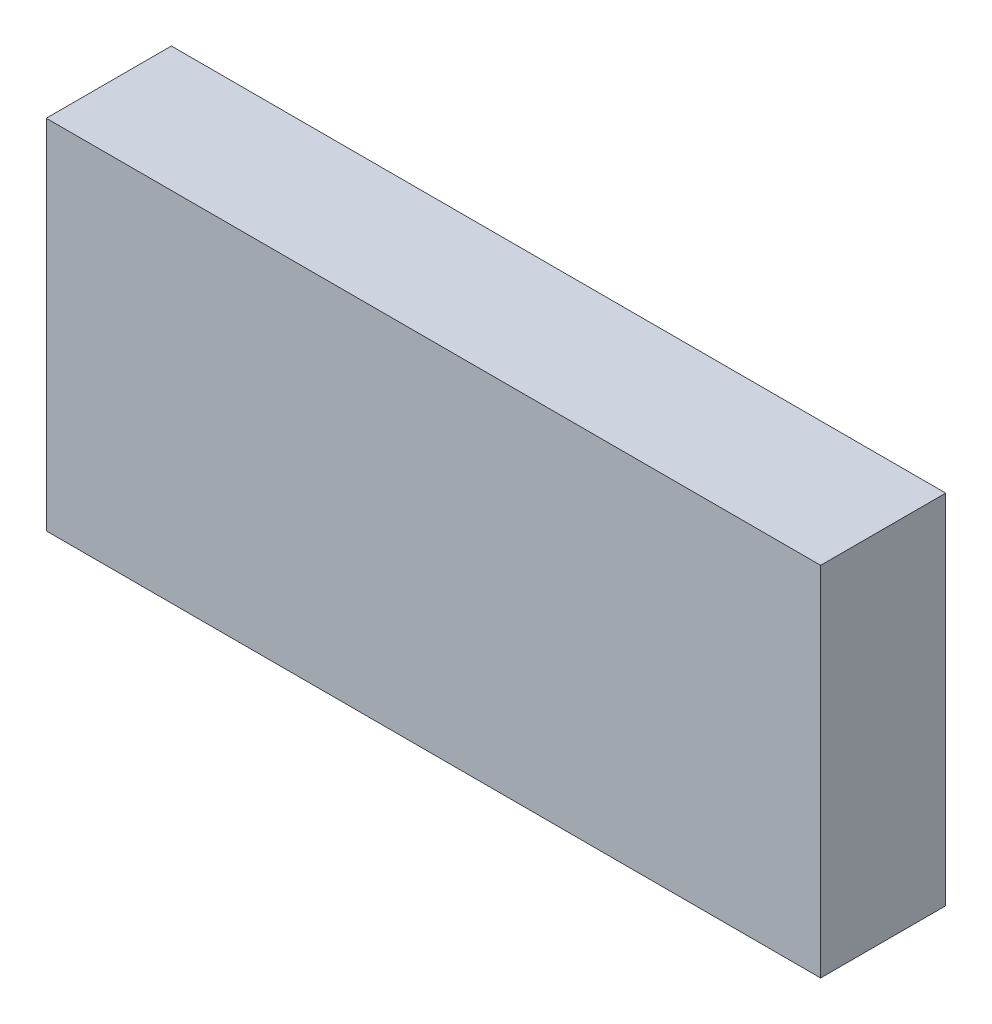
ISO-10303-21;
HEADER;
FILE_DESCRIPTION(('STEP AP214'),'2;1');
FILE_NAME('part.step','',(''),(''),'','','');
FILE_SCHEMA(('AUTOMOTIVE_DESIGN { 1 0 10303 214 1 1 1 1 }'));
ENDSEC;
DATA;
#1=APPLICATION_CONTEXT('core data for automotive mechanical design processes');
#2=APPLICATION_PROTOCOL_DEFINITION('international standard','automotive_design',2000,#1);
#3=PRODUCT_CONTEXT('',#1,'mechanical');
#4=PRODUCT('Part','Part','',(#3));
#5=PRODUCT_RELATED_PRODUCT_CATEGORY('part','',(#4));
#6=PRODUCT_DEFINITION_FORMATION('','',#4);
#7=PRODUCT_DEFINITION_CONTEXT('part definition',#1,'design');
#8=PRODUCT_DEFINITION('design','',#6,#7);
#9=PRODUCT_DEFINITION_SHAPE('','',#8);
#10=(LENGTH_UNIT() NAMED_UNIT(*) SI_UNIT(.MILLI.,.METRE.));
#11=(NAMED_UNIT(*) PLANE_ANGLE_UNIT() SI_UNIT($,.RADIAN.));
#12=(NAMED_UNIT(*) SI_UNIT($,.STERADIAN.) SOLID_ANGLE_UNIT());
#13=UNCERTAINTY_MEASURE_WITH_UNIT(LENGTH_MEASURE(1.E-05),#10,'distance_accuracy_value','');
#14=(GEOMETRIC_REPRESENTATION_CONTEXT(3) GLOBAL_UNCERTAINTY_ASSIGNED_CONTEXT((#13)) GLOBAL_UNIT_ASSIGNED_CONTEXT((#10,
#11,#12)) REPRESENTATION_CONTEXT('',''));
#15=CARTESIAN_POINT('',(0.,0.,0.));
#16=DIRECTION('',(0.,0.,1.));
#17=DIRECTION('',(1.,0.,0.));
#18=AXIS2_PLACEMENT_3D('',#15,#16,#17);
#19=CARTESIAN_POINT('',(-65.,-30.,21.));
#20=DIRECTION('',(1.,0.,0.));
#21=DIRECTION('',(0.,0.,-1.));
#22=AXIS2_PLACEMENT_3D('',#19,#20,#21);
#23=PLANE('',#22);
#24=DIRECTION('',(0.,-1.,0.));
#25=VECTOR('',#24,1.);
#26=CARTESIAN_POINT('',(-65.,-30.,0.));
#27=LINE('',#26,#25);
#28=CARTESIAN_POINT('',(-65.,30.,0.));
#29=VERTEX_POINT('',#28);
#30=CARTESIAN_POINT('',(-65.,-30.,0.));
#31=VERTEX_POINT('',#30);
#32=EDGE_CURVE('E95',#29,#31,#27,.T.);
#33=ORIENTED_EDGE('',*,*,#32,.T.);
#34=DIRECTION('',(0.,0.,-1.));
#35=VECTOR('',#34,1.);
#36=CARTESIAN_POINT('',(-65.,-30.,21.));
#37=LINE('',#36,#35);
#38=CARTESIAN_POINT('',(-65.,-30.,21.));
#39=VERTEX_POINT('',#38);
#40=EDGE_CURVE('E11',#39,#31,#37,.T.);
#41=ORIENTED_EDGE('',*,*,#40,.F.);
#42=DIRECTION('',(0.,-1.,0.));
#43=VECTOR('',#42,1.);
#44=CARTESIAN_POINT('',(-65.,-30.,21.));
#45=LINE('',#44,#43);
#46=CARTESIAN_POINT('',(-65.,30.,21.));
#47=VERTEX_POINT('',#46);
#48=EDGE_CURVE('E83',#47,#39,#45,.T.);
#49=ORIENTED_EDGE('',*,*,#48,.F.);
#50=DIRECTION('',(0.,0.,-1.));
#51=VECTOR('',#50,1.);
#52=CARTESIAN_POINT('',(-65.,30.,21.));
#53=LINE('',#52,#51);
#54=EDGE_CURVE('E91',#47,#29,#53,.T.);
#55=ORIENTED_EDGE('',*,*,#54,.T.);
#56=EDGE_LOOP('',(#33,#41,#49,#55));
#57=FACE_BOUND('',#56,.T.);
#58=ADVANCED_FACE('F32',(#57),#23,.F.);
#59=CARTESIAN_POINT('',(-65.,-30.,21.));
#60=DIRECTION('',(0.,1.,0.));
#61=DIRECTION('',(0.,0.,1.));
#62=AXIS2_PLACEMENT_3D('',#59,#60,#61);
#63=PLANE('',#62);
#64=DIRECTION('',(1.,0.,0.));
#65=VECTOR('',#64,1.);
#66=CARTESIAN_POINT('',(-65.,-30.,0.));
#67=LINE('',#66,#65);
#68=CARTESIAN_POINT('',(65.,-30.,0.));
#69=VERTEX_POINT('',#68);
#70=EDGE_CURVE('E87',#31,#69,#67,.T.);
#71=ORIENTED_EDGE('',*,*,#70,.T.);
#72=DIRECTION('',(0.,0.,-1.));
#73=VECTOR('',#72,1.);
#74=CARTESIAN_POINT('',(65.,-30.,21.));
#75=LINE('',#74,#73);
#76=CARTESIAN_POINT('',(65.,-30.,21.));
#77=VERTEX_POINT('',#76);
#78=EDGE_CURVE('E40',#77,#69,#75,.T.);
#79=ORIENTED_EDGE('',*,*,#78,.F.);
#80=DIRECTION('',(1.,0.,0.));
#81=VECTOR('',#80,1.);
#82=CARTESIAN_POINT('',(-65.,-30.,21.));
#83=LINE('',#82,#81);
#84=EDGE_CURVE('E78',#39,#77,#83,.T.);
#85=ORIENTED_EDGE('',*,*,#84,.F.);
#86=ORIENTED_EDGE('',*,*,#40,.T.);
#87=EDGE_LOOP('',(#71,#79,#85,#86));
#88=FACE_BOUND('',#87,.T.);
#89=ADVANCED_FACE('F86',(#88),#63,.F.);
#90=CARTESIAN_POINT('',(65.,-30.,21.));
#91=DIRECTION('',(-1.,0.,0.));
#92=DIRECTION('',(0.,0.,1.));
#93=AXIS2_PLACEMENT_3D('',#90,#91,#92);
#94=PLANE('',#93);
#95=DIRECTION('',(0.,1.,0.));
#96=VECTOR('',#95,1.);
#97=CARTESIAN_POINT('',(65.,-30.,0.));
#98=LINE('',#97,#96);
#99=CARTESIAN_POINT('',(65.,30.,0.));
#100=VERTEX_POINT('',#99);
#101=EDGE_CURVE('E65',#69,#100,#98,.T.);
#102=ORIENTED_EDGE('',*,*,#101,.T.);
#103=DIRECTION('',(0.,0.,-1.));
#104=VECTOR('',#103,1.);
#105=CARTESIAN_POINT('',(65.,30.,21.));
#106=LINE('',#105,#104);
#107=CARTESIAN_POINT('',(65.,30.,21.));
#108=VERTEX_POINT('',#107);
#109=EDGE_CURVE('E88',#108,#100,#106,.T.);
#110=ORIENTED_EDGE('',*,*,#109,.F.);
#111=DIRECTION('',(0.,1.,0.));
#112=VECTOR('',#111,1.);
#113=CARTESIAN_POINT('',(65.,-30.,21.));
#114=LINE('',#113,#112);
#115=EDGE_CURVE('E81',#77,#108,#114,.T.);
#116=ORIENTED_EDGE('',*,*,#115,.F.);
#117=ORIENTED_EDGE('',*,*,#78,.T.);
#118=EDGE_LOOP('',(#102,#110,#116,#117));
#119=FACE_BOUND('',#118,.T.);
#120=ADVANCED_FACE('F89',(#119),#94,.F.);
#121=CARTESIAN_POINT('',(-65.,30.,21.));
#122=DIRECTION('',(0.,-1.,0.));
#123=DIRECTION('',(0.,0.,-1.));
#124=AXIS2_PLACEMENT_3D('',#121,#122,#123);
#125=PLANE('',#124);
#126=DIRECTION('',(-1.,0.,0.));
#127=VECTOR('',#126,1.);
#128=CARTESIAN_POINT('',(-65.,30.,0.));
#129=LINE('',#128,#127);
#130=EDGE_CURVE('E71',#100,#29,#129,.T.);
#131=ORIENTED_EDGE('',*,*,#130,.T.);
#132=ORIENTED_EDGE('',*,*,#54,.F.);
#133=DIRECTION('',(-1.,0.,0.));
#134=VECTOR('',#133,1.);
#135=CARTESIAN_POINT('',(-65.,30.,21.));
#136=LINE('',#135,#134);
#137=EDGE_CURVE('E48',#108,#47,#136,.T.);
#138=ORIENTED_EDGE('',*,*,#137,.F.);
#139=ORIENTED_EDGE('',*,*,#109,.T.);
#140=EDGE_LOOP('',(#131,#132,#138,#139));
#141=FACE_BOUND('',#140,.T.);
#142=ADVANCED_FACE('F102',(#141),#125,.F.);
#143=CARTESIAN_POINT('',(0.,0.,21.));
#144=DIRECTION('',(0.,0.,-1.));
#145=DIRECTION('',(-1.,0.,0.));
#146=AXIS2_PLACEMENT_3D('',#143,#144,#145);
#147=PLANE('',#146);
#148=ORIENTED_EDGE('',*,*,#48,.T.);
#149=ORIENTED_EDGE('',*,*,#84,.T.);
#150=ORIENTED_EDGE('',*,*,#115,.T.);
#151=ORIENTED_EDGE('',*,*,#137,.T.);
#152=EDGE_LOOP('',(#148,#149,#150,#151));
#153=FACE_BOUND('',#152,.T.);
#154=ADVANCED_FACE('F79',(#153),#147,.F.);
#155=CARTESIAN_POINT('',(0.,0.,0.));
#156=DIRECTION('',(0.,0.,-1.));
#157=DIRECTION('',(-1.,0.,0.));
#158=AXIS2_PLACEMENT_3D('',#155,#156,#157);
#159=PLANE('',#158);
#160=ORIENTED_EDGE('',*,*,#32,.F.);
#161=ORIENTED_EDGE('',*,*,#130,.F.);
#162=ORIENTED_EDGE('',*,*,#101,.F.);
#163=ORIENTED_EDGE('',*,*,#70,.F.);
#164=EDGE_LOOP('',(#160,#161,#162,#163));
#165=FACE_BOUND('',#164,.T.);
#166=ADVANCED_FACE('F105',(#165),#159,.T.);
#167=CLOSED_SHELL('',(#58,#89,#120,#142,#154,#166));
#168=MANIFOLD_SOLID_BREP('B2',#167);
#169=ADVANCED_BREP_SHAPE_REPRESENTATION('',(#18,#168),#14);
#170=SHAPE_DEFINITION_REPRESENTATION(#9,#169);
ENDSEC;
END-ISO-10303-21;
